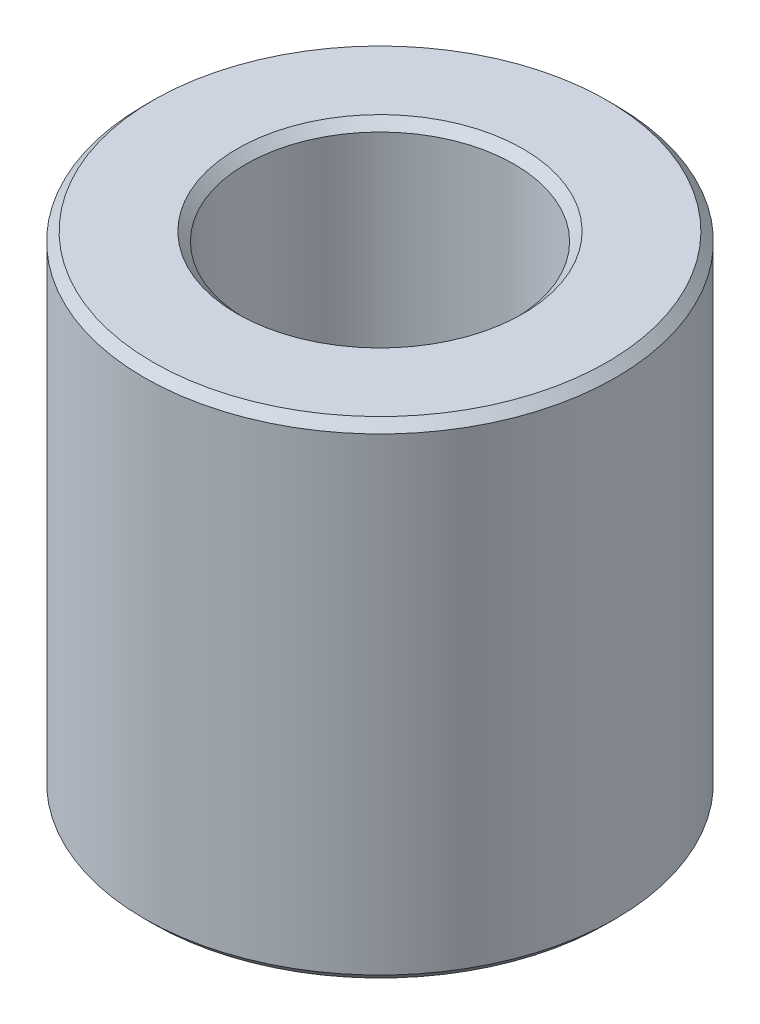
ISO-10303-21;
HEADER;
FILE_DESCRIPTION(('STEP AP214'),'2;1');
FILE_NAME('part.step','',(''),(''),'','','');
FILE_SCHEMA(('AUTOMOTIVE_DESIGN { 1 0 10303 214 1 1 1 1 }'));
ENDSEC;
DATA;
#1=APPLICATION_CONTEXT('core data for automotive mechanical design processes');
#2=APPLICATION_PROTOCOL_DEFINITION('international standard','automotive_design',2000,#1);
#3=PRODUCT_CONTEXT('',#1,'mechanical');
#4=PRODUCT('Part','Part','',(#3));
#5=PRODUCT_RELATED_PRODUCT_CATEGORY('part','',(#4));
#6=PRODUCT_DEFINITION_FORMATION('','',#4);
#7=PRODUCT_DEFINITION_CONTEXT('part definition',#1,'design');
#8=PRODUCT_DEFINITION('design','',#6,#7);
#9=PRODUCT_DEFINITION_SHAPE('','',#8);
#10=(LENGTH_UNIT() NAMED_UNIT(*) SI_UNIT(.MILLI.,.METRE.));
#11=(NAMED_UNIT(*) PLANE_ANGLE_UNIT() SI_UNIT($,.RADIAN.));
#12=(NAMED_UNIT(*) SI_UNIT($,.STERADIAN.) SOLID_ANGLE_UNIT());
#13=UNCERTAINTY_MEASURE_WITH_UNIT(LENGTH_MEASURE(1.E-05),#10,'distance_accuracy_value','');
#14=(GEOMETRIC_REPRESENTATION_CONTEXT(3) GLOBAL_UNCERTAINTY_ASSIGNED_CONTEXT((#13)) GLOBAL_UNIT_ASSIGNED_CONTEXT((#10,
#11,#12)) REPRESENTATION_CONTEXT('',''));
#15=CARTESIAN_POINT('',(0.,0.,0.));
#16=DIRECTION('',(0.,0.,1.));
#17=DIRECTION('',(1.,0.,0.));
#18=AXIS2_PLACEMENT_3D('',#15,#16,#17);
#19=CARTESIAN_POINT('',(0.,16.5,0.));
#20=DIRECTION('',(0.,1.,0.));
#21=DIRECTION('',(0.,0.,1.));
#22=AXIS2_PLACEMENT_3D('',#19,#20,#21);
#23=PLANE('',#22);
#24=CARTESIAN_POINT('',(0.,16.5,0.));
#25=DIRECTION('',(0.,1.,0.));
#26=DIRECTION('',(0.,0.,1.));
#27=AXIS2_PLACEMENT_3D('',#24,#25,#26);
#28=CIRCLE('',#27,7.7);
#29=CARTESIAN_POINT('',(0.,16.5,7.7));
#30=VERTEX_POINT('',#29);
#31=EDGE_CURVE('E10',#30,#30,#28,.T.);
#32=ORIENTED_EDGE('',*,*,#31,.T.);
#33=EDGE_LOOP('',(#32));
#34=FACE_BOUND('',#33,.T.);
#35=CARTESIAN_POINT('',(0.,16.5,0.));
#36=DIRECTION('',(0.,1.,0.));
#37=DIRECTION('',(0.,0.,1.));
#38=AXIS2_PLACEMENT_3D('',#35,#36,#37);
#39=CIRCLE('',#38,4.85);
#40=CARTESIAN_POINT('',(0.,16.5,4.85));
#41=VERTEX_POINT('',#40);
#42=EDGE_CURVE('E41',#41,#41,#39,.F.);
#43=ORIENTED_EDGE('',*,*,#42,.T.);
#44=EDGE_LOOP('',(#43));
#45=FACE_BOUND('',#44,.T.);
#46=ADVANCED_FACE('F33',(#34,#45),#23,.T.);
#47=CARTESIAN_POINT('',(0.,0.,0.));
#48=DIRECTION('',(0.,1.,0.));
#49=DIRECTION('',(0.,0.,1.));
#50=AXIS2_PLACEMENT_3D('',#47,#48,#49);
#51=PLANE('',#50);
#52=CARTESIAN_POINT('',(0.,0.,0.));
#53=DIRECTION('',(0.,1.,0.));
#54=DIRECTION('',(0.,0.,1.));
#55=AXIS2_PLACEMENT_3D('',#52,#53,#54);
#56=CIRCLE('',#55,4.85);
#57=CARTESIAN_POINT('',(0.,0.,4.85));
#58=VERTEX_POINT('',#57);
#59=EDGE_CURVE('E60',#58,#58,#56,.T.);
#60=ORIENTED_EDGE('',*,*,#59,.T.);
#61=EDGE_LOOP('',(#60));
#62=FACE_BOUND('',#61,.T.);
#63=CARTESIAN_POINT('',(0.,0.,0.));
#64=DIRECTION('',(0.,1.,0.));
#65=DIRECTION('',(0.,0.,1.));
#66=AXIS2_PLACEMENT_3D('',#63,#64,#65);
#67=CIRCLE('',#66,7.7);
#68=CARTESIAN_POINT('',(0.,0.,7.7));
#69=VERTEX_POINT('',#68);
#70=EDGE_CURVE('E63',#69,#69,#67,.F.);
#71=ORIENTED_EDGE('',*,*,#70,.T.);
#72=EDGE_LOOP('',(#71));
#73=FACE_BOUND('',#72,.T.);
#74=ADVANCED_FACE('F67',(#62,#73),#51,.F.);
#75=CARTESIAN_POINT('',(0.,16.5,0.));
#76=DIRECTION('',(0.,-1.,0.));
#77=DIRECTION('',(0.,0.,-1.));
#78=AXIS2_PLACEMENT_3D('',#75,#76,#77);
#79=CYLINDRICAL_SURFACE('',#78,8.);
#80=CARTESIAN_POINT('',(0.,0.300000000000002,0.));
#81=DIRECTION('',(0.,1.,0.));
#82=DIRECTION('',(0.,0.,1.));
#83=AXIS2_PLACEMENT_3D('',#80,#81,#82);
#84=CIRCLE('',#83,8.);
#85=CARTESIAN_POINT('',(0.,0.300000000000002,8.));
#86=VERTEX_POINT('',#85);
#87=EDGE_CURVE('E45',#86,#86,#84,.T.);
#88=ORIENTED_EDGE('',*,*,#87,.T.);
#89=EDGE_LOOP('',(#88));
#90=FACE_BOUND('',#89,.T.);
#91=CARTESIAN_POINT('',(0.,16.2,0.));
#92=DIRECTION('',(0.,1.,0.));
#93=DIRECTION('',(0.,0.,1.));
#94=AXIS2_PLACEMENT_3D('',#91,#92,#93);
#95=CIRCLE('',#94,8.);
#96=CARTESIAN_POINT('',(0.,16.2,8.));
#97=VERTEX_POINT('',#96);
#98=EDGE_CURVE('E49',#97,#97,#95,.F.);
#99=ORIENTED_EDGE('',*,*,#98,.T.);
#100=EDGE_LOOP('',(#99));
#101=FACE_BOUND('',#100,.T.);
#102=ADVANCED_FACE('F77',(#90,#101),#79,.T.);
#103=CARTESIAN_POINT('',(0.,16.5,0.));
#104=DIRECTION('',(0.,-1.,0.));
#105=DIRECTION('',(0.,0.,-1.));
#106=AXIS2_PLACEMENT_3D('',#103,#104,#105);
#107=CYLINDRICAL_SURFACE('',#106,4.55);
#108=CARTESIAN_POINT('',(0.,0.300000000000002,0.));
#109=DIRECTION('',(0.,1.,0.));
#110=DIRECTION('',(0.,0.,1.));
#111=AXIS2_PLACEMENT_3D('',#108,#109,#110);
#112=CIRCLE('',#111,4.55);
#113=CARTESIAN_POINT('',(0.,0.300000000000002,4.55));
#114=VERTEX_POINT('',#113);
#115=EDGE_CURVE('E54',#114,#114,#112,.F.);
#116=ORIENTED_EDGE('',*,*,#115,.T.);
#117=EDGE_LOOP('',(#116));
#118=FACE_BOUND('',#117,.T.);
#119=CARTESIAN_POINT('',(0.,16.2,0.));
#120=DIRECTION('',(0.,1.,0.));
#121=DIRECTION('',(0.,0.,1.));
#122=AXIS2_PLACEMENT_3D('',#119,#120,#121);
#123=CIRCLE('',#122,4.55);
#124=CARTESIAN_POINT('',(0.,16.2,4.55));
#125=VERTEX_POINT('',#124);
#126=EDGE_CURVE('E57',#125,#125,#123,.T.);
#127=ORIENTED_EDGE('',*,*,#126,.T.);
#128=EDGE_LOOP('',(#127));
#129=FACE_BOUND('',#128,.T.);
#130=ADVANCED_FACE('F80',(#118,#129),#107,.F.);
#131=CARTESIAN_POINT('',(0.,0.,0.));
#132=DIRECTION('',(0.,-1.,0.));
#133=DIRECTION('',(0.,0.,-1.));
#134=AXIS2_PLACEMENT_3D('',#131,#132,#133);
#135=CONICAL_SURFACE('',#134,4.85,0.785398163397445);
#136=ORIENTED_EDGE('',*,*,#115,.F.);
#137=EDGE_LOOP('',(#136));
#138=FACE_BOUND('',#137,.T.);
#139=ORIENTED_EDGE('',*,*,#59,.F.);
#140=EDGE_LOOP('',(#139));
#141=FACE_BOUND('',#140,.T.);
#142=ADVANCED_FACE('F73',(#138,#141),#135,.F.);
#143=CARTESIAN_POINT('',(0.,0.300000000000002,0.));
#144=DIRECTION('',(0.,1.,0.));
#145=DIRECTION('',(0.,0.,1.));
#146=AXIS2_PLACEMENT_3D('',#143,#144,#145);
#147=CONICAL_SURFACE('',#146,8.,0.785398163397448);
#148=ORIENTED_EDGE('',*,*,#70,.F.);
#149=EDGE_LOOP('',(#148));
#150=FACE_BOUND('',#149,.T.);
#151=ORIENTED_EDGE('',*,*,#87,.F.);
#152=EDGE_LOOP('',(#151));
#153=FACE_BOUND('',#152,.T.);
#154=ADVANCED_FACE('F69',(#150,#153),#147,.T.);
#155=CARTESIAN_POINT('',(0.,16.5,0.));
#156=DIRECTION('',(0.,-1.,0.));
#157=DIRECTION('',(0.,0.,-1.));
#158=AXIS2_PLACEMENT_3D('',#155,#156,#157);
#159=CONICAL_SURFACE('',#158,7.7,0.785398163397448);
#160=ORIENTED_EDGE('',*,*,#98,.F.);
#161=EDGE_LOOP('',(#160));
#162=FACE_BOUND('',#161,.T.);
#163=ORIENTED_EDGE('',*,*,#31,.F.);
#164=EDGE_LOOP('',(#163));
#165=FACE_BOUND('',#164,.T.);
#166=ADVANCED_FACE('F72',(#162,#165),#159,.T.);
#167=CARTESIAN_POINT('',(0.,16.2,0.));
#168=DIRECTION('',(0.,1.,0.));
#169=DIRECTION('',(0.,0.,1.));
#170=AXIS2_PLACEMENT_3D('',#167,#168,#169);
#171=CONICAL_SURFACE('',#170,4.55,0.785398163397445);
#172=ORIENTED_EDGE('',*,*,#42,.F.);
#173=EDGE_LOOP('',(#172));
#174=FACE_BOUND('',#173,.T.);
#175=ORIENTED_EDGE('',*,*,#126,.F.);
#176=EDGE_LOOP('',(#175));
#177=FACE_BOUND('',#176,.T.);
#178=ADVANCED_FACE('F36',(#174,#177),#171,.F.);
#179=CLOSED_SHELL('',(#46,#74,#102,#130,#142,#154,#166,#178));
#180=MANIFOLD_SOLID_BREP('B2',#179);
#181=ADVANCED_BREP_SHAPE_REPRESENTATION('',(#18,#180),#14);
#182=SHAPE_DEFINITION_REPRESENTATION(#9,#181);
ENDSEC;
END-ISO-10303-21;
